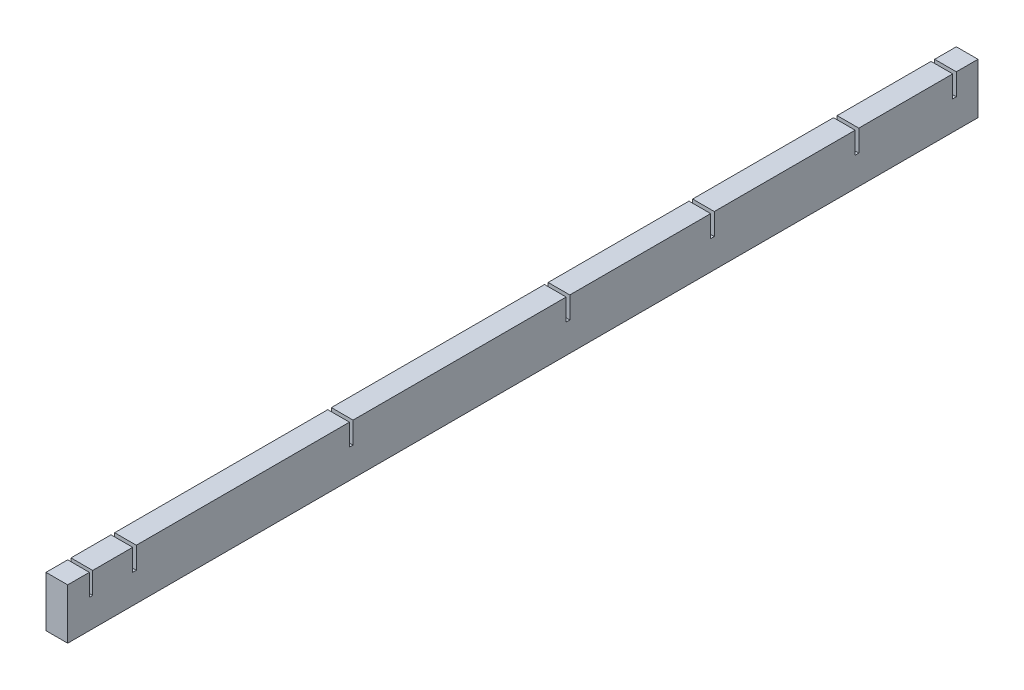
ISO-10303-21;
HEADER;
FILE_DESCRIPTION(('STEP AP214'),'2;1');
FILE_NAME('part.step','',(''),(''),'','','');
FILE_SCHEMA(('AUTOMOTIVE_DESIGN { 1 0 10303 214 1 1 1 1 }'));
ENDSEC;
DATA;
#1=APPLICATION_CONTEXT('core data for automotive mechanical design processes');
#2=APPLICATION_PROTOCOL_DEFINITION('international standard','automotive_design',2000,#1);
#3=PRODUCT_CONTEXT('',#1,'mechanical');
#4=PRODUCT('Part','Part','',(#3));
#5=PRODUCT_RELATED_PRODUCT_CATEGORY('part','',(#4));
#6=PRODUCT_DEFINITION_FORMATION('','',#4);
#7=PRODUCT_DEFINITION_CONTEXT('part definition',#1,'design');
#8=PRODUCT_DEFINITION('design','',#6,#7);
#9=PRODUCT_DEFINITION_SHAPE('','',#8);
#10=(LENGTH_UNIT() NAMED_UNIT(*) SI_UNIT(.MILLI.,.METRE.));
#11=(NAMED_UNIT(*) PLANE_ANGLE_UNIT() SI_UNIT($,.RADIAN.));
#12=(NAMED_UNIT(*) SI_UNIT($,.STERADIAN.) SOLID_ANGLE_UNIT());
#13=UNCERTAINTY_MEASURE_WITH_UNIT(LENGTH_MEASURE(1.E-05),#10,'distance_accuracy_value','');
#14=(GEOMETRIC_REPRESENTATION_CONTEXT(3) GLOBAL_UNCERTAINTY_ASSIGNED_CONTEXT((#13)) GLOBAL_UNIT_ASSIGNED_CONTEXT((#10,
#11,#12)) REPRESENTATION_CONTEXT('',''));
#15=CARTESIAN_POINT('',(0.,0.,0.));
#16=DIRECTION('',(0.,0.,1.));
#17=DIRECTION('',(1.,0.,0.));
#18=AXIS2_PLACEMENT_3D('',#15,#16,#17);
#19=CARTESIAN_POINT('',(-19.05,128.5875,-215.9));
#20=DIRECTION('',(0.,1.,0.));
#21=DIRECTION('',(0.,0.,1.));
#22=AXIS2_PLACEMENT_3D('',#19,#20,#21);
#23=PLANE('',#22);
#24=DIRECTION('',(1.,0.,0.));
#25=VECTOR('',#24,1.);
#26=CARTESIAN_POINT('',(-19.05,128.5875,508.));
#27=LINE('',#26,#25);
#28=CARTESIAN_POINT('',(-19.05,128.5875,508.));
#29=VERTEX_POINT('',#28);
#30=CARTESIAN_POINT('',(19.05,128.5875,508.));
#31=VERTEX_POINT('',#30);
#32=EDGE_CURVE('E275',#29,#31,#27,.T.);
#33=ORIENTED_EDGE('',*,*,#32,.F.);
#34=DIRECTION('',(0.,0.,1.));
#35=VECTOR('',#34,1.);
#36=CARTESIAN_POINT('',(-19.05,128.5875,-215.9));
#37=LINE('',#36,#35);
#38=CARTESIAN_POINT('',(-19.05,128.5875,882.65));
#39=VERTEX_POINT('',#38);
#40=EDGE_CURVE('E547',#29,#39,#37,.T.);
#41=ORIENTED_EDGE('',*,*,#40,.T.);
#42=DIRECTION('',(1.,0.,0.));
#43=VECTOR('',#42,1.);
#44=CARTESIAN_POINT('',(-19.05,128.5875,882.65));
#45=LINE('',#44,#43);
#46=CARTESIAN_POINT('',(19.05,128.5875,882.65));
#47=VERTEX_POINT('',#46);
#48=EDGE_CURVE('E328',#39,#47,#45,.T.);
#49=ORIENTED_EDGE('',*,*,#48,.T.);
#50=DIRECTION('',(0.,0.,1.));
#51=VECTOR('',#50,1.);
#52=CARTESIAN_POINT('',(19.05,128.5875,-215.9));
#53=LINE('',#52,#51);
#54=EDGE_CURVE('E530',#31,#47,#53,.T.);
#55=ORIENTED_EDGE('',*,*,#54,.F.);
#56=EDGE_LOOP('',(#33,#41,#49,#55));
#57=FACE_BOUND('',#56,.T.);
#58=ADVANCED_FACE('F34',(#57),#23,.T.);
#59=DIRECTION('',(1.,0.,0.));
#60=VECTOR('',#59,1.);
#61=CARTESIAN_POINT('',(-19.05,128.5875,1270.));
#62=LINE('',#61,#60);
#63=CARTESIAN_POINT('',(-19.05,128.5875,1270.));
#64=VERTEX_POINT('',#63);
#65=CARTESIAN_POINT('',(19.05,128.5875,1270.));
#66=VERTEX_POINT('',#65);
#67=EDGE_CURVE('E277',#64,#66,#62,.T.);
#68=ORIENTED_EDGE('',*,*,#67,.F.);
#69=CARTESIAN_POINT('',(-19.05,128.5875,1340.358));
#70=VERTEX_POINT('',#69);
#71=EDGE_CURVE('E268',#64,#70,#37,.T.);
#72=ORIENTED_EDGE('',*,*,#71,.T.);
#73=DIRECTION('',(1.,0.,0.));
#74=VECTOR('',#73,1.);
#75=CARTESIAN_POINT('',(-19.05,128.5875,1340.358));
#76=LINE('',#75,#74);
#77=CARTESIAN_POINT('',(19.05,128.5875,1340.358));
#78=VERTEX_POINT('',#77);
#79=EDGE_CURVE('E429',#70,#78,#76,.T.);
#80=ORIENTED_EDGE('',*,*,#79,.T.);
#81=EDGE_CURVE('E473',#66,#78,#53,.T.);
#82=ORIENTED_EDGE('',*,*,#81,.F.);
#83=EDGE_LOOP('',(#68,#72,#80,#82));
#84=FACE_BOUND('',#83,.T.);
#85=ADVANCED_FACE('F595',(#84),#23,.T.);
#86=DIRECTION('',(1.,0.,0.));
#87=VECTOR('',#86,1.);
#88=CARTESIAN_POINT('',(-19.05,128.5875,1263.65));
#89=LINE('',#88,#87);
#90=CARTESIAN_POINT('',(-19.05,128.5875,1263.65));
#91=VERTEX_POINT('',#90);
#92=CARTESIAN_POINT('',(19.05,128.5875,1263.65));
#93=VERTEX_POINT('',#92);
#94=EDGE_CURVE('E280',#91,#93,#89,.T.);
#95=ORIENTED_EDGE('',*,*,#94,.T.);
#96=CARTESIAN_POINT('',(19.05,128.5875,889.));
#97=VERTEX_POINT('',#96);
#98=EDGE_CURVE('E478',#97,#93,#53,.T.);
#99=ORIENTED_EDGE('',*,*,#98,.F.);
#100=DIRECTION('',(1.,0.,0.));
#101=VECTOR('',#100,1.);
#102=CARTESIAN_POINT('',(-19.05,128.5875,889.));
#103=LINE('',#102,#101);
#104=CARTESIAN_POINT('',(-19.05,128.5875,889.));
#105=VERTEX_POINT('',#104);
#106=EDGE_CURVE('E325',#105,#97,#103,.T.);
#107=ORIENTED_EDGE('',*,*,#106,.F.);
#108=EDGE_CURVE('E466',#105,#91,#37,.T.);
#109=ORIENTED_EDGE('',*,*,#108,.T.);
#110=EDGE_LOOP('',(#95,#99,#107,#109));
#111=FACE_BOUND('',#110,.T.);
#112=ADVANCED_FACE('F543',(#111),#23,.T.);
#113=DIRECTION('',(1.,0.,0.));
#114=VECTOR('',#113,1.);
#115=CARTESIAN_POINT('',(-19.05,128.5875,501.65));
#116=LINE('',#115,#114);
#117=CARTESIAN_POINT('',(-19.05,128.5875,501.65));
#118=VERTEX_POINT('',#117);
#119=CARTESIAN_POINT('',(19.05,128.5875,501.65));
#120=VERTEX_POINT('',#119);
#121=EDGE_CURVE('E302',#118,#120,#116,.T.);
#122=ORIENTED_EDGE('',*,*,#121,.T.);
#123=CARTESIAN_POINT('',(19.05,128.5875,254.));
#124=VERTEX_POINT('',#123);
#125=EDGE_CURVE('E528',#124,#120,#53,.T.);
#126=ORIENTED_EDGE('',*,*,#125,.F.);
#127=DIRECTION('',(1.,0.,0.));
#128=VECTOR('',#127,1.);
#129=CARTESIAN_POINT('',(-19.05,128.5875,254.));
#130=LINE('',#129,#128);
#131=CARTESIAN_POINT('',(-19.05,128.5875,254.));
#132=VERTEX_POINT('',#131);
#133=EDGE_CURVE('E297',#132,#124,#130,.T.);
#134=ORIENTED_EDGE('',*,*,#133,.F.);
#135=EDGE_CURVE('E549',#132,#118,#37,.T.);
#136=ORIENTED_EDGE('',*,*,#135,.T.);
#137=EDGE_LOOP('',(#122,#126,#134,#136));
#138=FACE_BOUND('',#137,.T.);
#139=ADVANCED_FACE('F566',(#138),#23,.T.);
#140=DIRECTION('',(1.,0.,0.));
#141=VECTOR('',#140,1.);
#142=CARTESIAN_POINT('',(-19.05,128.5875,247.65));
#143=LINE('',#142,#141);
#144=CARTESIAN_POINT('',(-19.05,128.5875,247.65));
#145=VERTEX_POINT('',#144);
#146=CARTESIAN_POINT('',(19.05,128.5875,247.65));
#147=VERTEX_POINT('',#146);
#148=EDGE_CURVE('E354',#145,#147,#143,.T.);
#149=ORIENTED_EDGE('',*,*,#148,.T.);
#150=CARTESIAN_POINT('',(19.05,128.5875,0.));
#151=VERTEX_POINT('',#150);
#152=EDGE_CURVE('E477',#151,#147,#53,.T.);
#153=ORIENTED_EDGE('',*,*,#152,.F.);
#154=DIRECTION('',(1.,0.,0.));
#155=VECTOR('',#154,1.);
#156=CARTESIAN_POINT('',(-19.05,128.5875,0.));
#157=LINE('',#156,#155);
#158=CARTESIAN_POINT('',(-19.05,128.5875,0.));
#159=VERTEX_POINT('',#158);
#160=EDGE_CURVE('E349',#159,#151,#157,.T.);
#161=ORIENTED_EDGE('',*,*,#160,.F.);
#162=EDGE_CURVE('E465',#159,#145,#37,.T.);
#163=ORIENTED_EDGE('',*,*,#162,.T.);
#164=EDGE_LOOP('',(#149,#153,#161,#163));
#165=FACE_BOUND('',#164,.T.);
#166=ADVANCED_FACE('F526',(#165),#23,.T.);
#167=DIRECTION('',(1.,0.,0.));
#168=VECTOR('',#167,1.);
#169=CARTESIAN_POINT('',(-19.05,128.5875,-177.8));
#170=LINE('',#169,#168);
#171=CARTESIAN_POINT('',(-19.05,128.5875,-177.8));
#172=VERTEX_POINT('',#171);
#173=CARTESIAN_POINT('',(19.05,128.5875,-177.8));
#174=VERTEX_POINT('',#173);
#175=EDGE_CURVE('E394',#172,#174,#170,.T.);
#176=ORIENTED_EDGE('',*,*,#175,.T.);
#177=CARTESIAN_POINT('',(19.05,128.5875,-215.9));
#178=VERTEX_POINT('',#177);
#179=EDGE_CURVE('E38',#178,#174,#53,.T.);
#180=ORIENTED_EDGE('',*,*,#179,.F.);
#181=DIRECTION('',(-1.,0.,0.));
#182=VECTOR('',#181,1.);
#183=CARTESIAN_POINT('',(-19.05,128.5875,-215.9));
#184=LINE('',#183,#182);
#185=CARTESIAN_POINT('',(-19.05,128.5875,-215.9));
#186=VERTEX_POINT('',#185);
#187=EDGE_CURVE('E449',#178,#186,#184,.T.);
#188=ORIENTED_EDGE('',*,*,#187,.T.);
#189=EDGE_CURVE('E459',#186,#172,#37,.T.);
#190=ORIENTED_EDGE('',*,*,#189,.T.);
#191=EDGE_LOOP('',(#176,#180,#188,#190));
#192=FACE_BOUND('',#191,.T.);
#193=ADVANCED_FACE('F497',(#192),#23,.T.);
#194=DIRECTION('',(1.,0.,0.));
#195=VECTOR('',#194,1.);
#196=CARTESIAN_POINT('',(-19.05,128.5875,1346.2));
#197=LINE('',#196,#195);
#198=CARTESIAN_POINT('',(-19.05,128.5875,1346.2));
#199=VERTEX_POINT('',#198);
#200=CARTESIAN_POINT('',(19.05,128.5875,1346.2));
#201=VERTEX_POINT('',#200);
#202=EDGE_CURVE('E426',#199,#201,#197,.T.);
#203=ORIENTED_EDGE('',*,*,#202,.F.);
#204=CARTESIAN_POINT('',(-19.05,128.5875,1384.3));
#205=VERTEX_POINT('',#204);
#206=EDGE_CURVE('E462',#199,#205,#37,.T.);
#207=ORIENTED_EDGE('',*,*,#206,.T.);
#208=DIRECTION('',(-1.,0.,0.));
#209=VECTOR('',#208,1.);
#210=CARTESIAN_POINT('',(-19.05,128.5875,1384.3));
#211=LINE('',#210,#209);
#212=CARTESIAN_POINT('',(19.05,128.5875,1384.3));
#213=VERTEX_POINT('',#212);
#214=EDGE_CURVE('E437',#213,#205,#211,.T.);
#215=ORIENTED_EDGE('',*,*,#214,.F.);
#216=EDGE_CURVE('E457',#201,#213,#53,.T.);
#217=ORIENTED_EDGE('',*,*,#216,.F.);
#218=EDGE_LOOP('',(#203,#207,#215,#217));
#219=FACE_BOUND('',#218,.T.);
#220=ADVANCED_FACE('F484',(#219),#23,.T.);
#221=CARTESIAN_POINT('',(19.05,39.6875,-215.9));
#222=DIRECTION('',(1.,0.,0.));
#223=DIRECTION('',(0.,0.,-1.));
#224=AXIS2_PLACEMENT_3D('',#221,#222,#223);
#225=PLANE('',#224);
#226=DIRECTION('',(0.,-1.,0.));
#227=VECTOR('',#226,1.);
#228=CARTESIAN_POINT('',(19.05,128.5875,508.));
#229=LINE('',#228,#227);
#230=CARTESIAN_POINT('',(19.05,90.4875,508.));
#231=VERTEX_POINT('',#230);
#232=EDGE_CURVE('E293',#31,#231,#229,.T.);
#233=ORIENTED_EDGE('',*,*,#232,.F.);
#234=ORIENTED_EDGE('',*,*,#54,.T.);
#235=DIRECTION('',(0.,1.,0.));
#236=VECTOR('',#235,1.);
#237=CARTESIAN_POINT('',(19.05,128.5875,882.65));
#238=LINE('',#237,#236);
#239=CARTESIAN_POINT('',(19.05,90.4875,882.65));
#240=VERTEX_POINT('',#239);
#241=EDGE_CURVE('E312',#240,#47,#238,.T.);
#242=ORIENTED_EDGE('',*,*,#241,.F.);
#243=DIRECTION('',(0.,0.,-1.));
#244=VECTOR('',#243,1.);
#245=CARTESIAN_POINT('',(19.05,90.4875,889.));
#246=LINE('',#245,#244);
#247=CARTESIAN_POINT('',(19.05,90.4875,889.));
#248=VERTEX_POINT('',#247);
#249=EDGE_CURVE('E321',#248,#240,#246,.T.);
#250=ORIENTED_EDGE('',*,*,#249,.F.);
#251=DIRECTION('',(0.,-1.,0.));
#252=VECTOR('',#251,1.);
#253=CARTESIAN_POINT('',(19.05,128.5875,889.));
#254=LINE('',#253,#252);
#255=EDGE_CURVE('E279',#97,#248,#254,.T.);
#256=ORIENTED_EDGE('',*,*,#255,.F.);
#257=ORIENTED_EDGE('',*,*,#98,.T.);
#258=DIRECTION('',(0.,1.,0.));
#259=VECTOR('',#258,1.);
#260=CARTESIAN_POINT('',(19.05,128.5875,1263.65));
#261=LINE('',#260,#259);
#262=CARTESIAN_POINT('',(19.05,90.4875,1263.65));
#263=VERTEX_POINT('',#262);
#264=EDGE_CURVE('E59',#263,#93,#261,.T.);
#265=ORIENTED_EDGE('',*,*,#264,.F.);
#266=DIRECTION('',(0.,0.,-1.));
#267=VECTOR('',#266,1.);
#268=CARTESIAN_POINT('',(19.05,90.4875,1270.));
#269=LINE('',#268,#267);
#270=CARTESIAN_POINT('',(19.05,90.4875,1270.));
#271=VERTEX_POINT('',#270);
#272=EDGE_CURVE('E270',#271,#263,#269,.T.);
#273=ORIENTED_EDGE('',*,*,#272,.F.);
#274=DIRECTION('',(0.,-1.,0.));
#275=VECTOR('',#274,1.);
#276=CARTESIAN_POINT('',(19.05,128.5875,1270.));
#277=LINE('',#276,#275);
#278=EDGE_CURVE('E250',#66,#271,#277,.T.);
#279=ORIENTED_EDGE('',*,*,#278,.F.);
#280=ORIENTED_EDGE('',*,*,#81,.T.);
#281=DIRECTION('',(0.,1.,0.));
#282=VECTOR('',#281,1.);
#283=CARTESIAN_POINT('',(19.05,128.5875,1340.358));
#284=LINE('',#283,#282);
#285=CARTESIAN_POINT('',(19.05,90.4875,1340.358));
#286=VERTEX_POINT('',#285);
#287=EDGE_CURVE('E413',#286,#78,#284,.T.);
#288=ORIENTED_EDGE('',*,*,#287,.F.);
#289=DIRECTION('',(0.,0.,-1.));
#290=VECTOR('',#289,1.);
#291=CARTESIAN_POINT('',(19.05,90.4875,1346.2));
#292=LINE('',#291,#290);
#293=CARTESIAN_POINT('',(19.05,90.4875,1346.2));
#294=VERTEX_POINT('',#293);
#295=EDGE_CURVE('E421',#294,#286,#292,.T.);
#296=ORIENTED_EDGE('',*,*,#295,.F.);
#297=DIRECTION('',(0.,-1.,0.));
#298=VECTOR('',#297,1.);
#299=CARTESIAN_POINT('',(19.05,128.5875,1346.2));
#300=LINE('',#299,#298);
#301=EDGE_CURVE('E327',#201,#294,#300,.T.);
#302=ORIENTED_EDGE('',*,*,#301,.F.);
#303=ORIENTED_EDGE('',*,*,#216,.T.);
#304=DIRECTION('',(0.,1.,0.));
#305=VECTOR('',#304,1.);
#306=CARTESIAN_POINT('',(19.05,39.6875,1384.3));
#307=LINE('',#306,#305);
#308=CARTESIAN_POINT('',(19.05,39.6875,1384.3));
#309=VERTEX_POINT('',#308);
#310=EDGE_CURVE('E428',#309,#213,#307,.T.);
#311=ORIENTED_EDGE('',*,*,#310,.F.);
#312=DIRECTION('',(0.,0.,1.));
#313=VECTOR('',#312,1.);
#314=CARTESIAN_POINT('',(19.05,39.6875,-215.9));
#315=LINE('',#314,#313);
#316=CARTESIAN_POINT('',(19.05,39.6875,-215.9));
#317=VERTEX_POINT('',#316);
#318=EDGE_CURVE('E11',#317,#309,#315,.T.);
#319=ORIENTED_EDGE('',*,*,#318,.F.);
#320=DIRECTION('',(0.,1.,0.));
#321=VECTOR('',#320,1.);
#322=CARTESIAN_POINT('',(19.05,39.6875,-215.9));
#323=LINE('',#322,#321);
#324=EDGE_CURVE('E446',#317,#178,#323,.T.);
#325=ORIENTED_EDGE('',*,*,#324,.T.);
#326=ORIENTED_EDGE('',*,*,#179,.T.);
#327=DIRECTION('',(0.,1.,0.));
#328=VECTOR('',#327,1.);
#329=CARTESIAN_POINT('',(19.05,128.5875,-177.8));
#330=LINE('',#329,#328);
#331=CARTESIAN_POINT('',(19.05,90.4875,-177.8));
#332=VERTEX_POINT('',#331);
#333=EDGE_CURVE('E395',#332,#174,#330,.T.);
#334=ORIENTED_EDGE('',*,*,#333,.F.);
#335=DIRECTION('',(0.,0.,-1.));
#336=VECTOR('',#335,1.);
#337=CARTESIAN_POINT('',(19.05,90.4875,-177.8));
#338=LINE('',#337,#336);
#339=CARTESIAN_POINT('',(19.05,90.4875,-171.45));
#340=VERTEX_POINT('',#339);
#341=EDGE_CURVE('E389',#340,#332,#338,.T.);
#342=ORIENTED_EDGE('',*,*,#341,.F.);
#343=DIRECTION('',(0.,-1.,0.));
#344=VECTOR('',#343,1.);
#345=CARTESIAN_POINT('',(19.05,128.5875,-171.45));
#346=LINE('',#345,#344);
#347=CARTESIAN_POINT('',(19.05,128.5875,-171.45));
#348=VERTEX_POINT('',#347);
#349=EDGE_CURVE('E397',#348,#340,#346,.T.);
#350=ORIENTED_EDGE('',*,*,#349,.F.);
#351=CARTESIAN_POINT('',(19.05,128.5875,-6.35000000000002));
#352=VERTEX_POINT('',#351);
#353=EDGE_CURVE('E472',#348,#352,#53,.T.);
#354=ORIENTED_EDGE('',*,*,#353,.T.);
#355=DIRECTION('',(0.,1.,0.));
#356=VECTOR('',#355,1.);
#357=CARTESIAN_POINT('',(19.05,128.5875,-6.35000000000003));
#358=LINE('',#357,#356);
#359=CARTESIAN_POINT('',(19.05,90.4875,-6.35000000000003));
#360=VERTEX_POINT('',#359);
#361=EDGE_CURVE('E364',#360,#352,#358,.T.);
#362=ORIENTED_EDGE('',*,*,#361,.F.);
#363=DIRECTION('',(0.,0.,-1.));
#364=VECTOR('',#363,1.);
#365=CARTESIAN_POINT('',(19.05,90.4875,0.));
#366=LINE('',#365,#364);
#367=CARTESIAN_POINT('',(19.05,90.4875,0.));
#368=VERTEX_POINT('',#367);
#369=EDGE_CURVE('E374',#368,#360,#366,.T.);
#370=ORIENTED_EDGE('',*,*,#369,.F.);
#371=DIRECTION('',(0.,-1.,0.));
#372=VECTOR('',#371,1.);
#373=CARTESIAN_POINT('',(19.05,128.5875,0.));
#374=LINE('',#373,#372);
#375=EDGE_CURVE('E371',#151,#368,#374,.T.);
#376=ORIENTED_EDGE('',*,*,#375,.F.);
#377=ORIENTED_EDGE('',*,*,#152,.T.);
#378=DIRECTION('',(0.,1.,0.));
#379=VECTOR('',#378,1.);
#380=CARTESIAN_POINT('',(19.05,128.5875,247.65));
#381=LINE('',#380,#379);
#382=CARTESIAN_POINT('',(19.05,90.4875,247.65));
#383=VERTEX_POINT('',#382);
#384=EDGE_CURVE('E338',#383,#147,#381,.T.);
#385=ORIENTED_EDGE('',*,*,#384,.F.);
#386=DIRECTION('',(0.,0.,-1.));
#387=VECTOR('',#386,1.);
#388=CARTESIAN_POINT('',(19.05,90.4875,254.));
#389=LINE('',#388,#387);
#390=CARTESIAN_POINT('',(19.05,90.4875,254.));
#391=VERTEX_POINT('',#390);
#392=EDGE_CURVE('E348',#391,#383,#389,.T.);
#393=ORIENTED_EDGE('',*,*,#392,.F.);
#394=DIRECTION('',(0.,-1.,0.));
#395=VECTOR('',#394,1.);
#396=CARTESIAN_POINT('',(19.05,128.5875,254.));
#397=LINE('',#396,#395);
#398=EDGE_CURVE('E345',#124,#391,#397,.T.);
#399=ORIENTED_EDGE('',*,*,#398,.F.);
#400=ORIENTED_EDGE('',*,*,#125,.T.);
#401=DIRECTION('',(0.,1.,0.));
#402=VECTOR('',#401,1.);
#403=CARTESIAN_POINT('',(19.05,128.5875,501.65));
#404=LINE('',#403,#402);
#405=CARTESIAN_POINT('',(19.05,90.4875,501.65));
#406=VERTEX_POINT('',#405);
#407=EDGE_CURVE('E286',#406,#120,#404,.T.);
#408=ORIENTED_EDGE('',*,*,#407,.F.);
#409=DIRECTION('',(0.,0.,-1.));
#410=VECTOR('',#409,1.);
#411=CARTESIAN_POINT('',(19.05,90.4875,508.));
#412=LINE('',#411,#410);
#413=EDGE_CURVE('E296',#231,#406,#412,.T.);
#414=ORIENTED_EDGE('',*,*,#413,.F.);
#415=EDGE_LOOP('',(#233,#234,#242,#250,#256,#257,#265,#273,#279,#280,#288,#296,#302,#303,#311,
#319,#325,#326,#334,#342,#350,#354,#362,#370,#376,#377,#385,#393,#399,#400,#408,#414));
#416=FACE_BOUND('',#415,.T.);
#417=ADVANCED_FACE('F36',(#416),#225,.T.);
#418=CARTESIAN_POINT('',(-19.05,39.6875,-215.9));
#419=DIRECTION('',(0.,-1.,0.));
#420=DIRECTION('',(0.,0.,-1.));
#421=AXIS2_PLACEMENT_3D('',#418,#419,#420);
#422=PLANE('',#421);
#423=ORIENTED_EDGE('',*,*,#318,.T.);
#424=DIRECTION('',(1.,0.,0.));
#425=VECTOR('',#424,1.);
#426=CARTESIAN_POINT('',(-19.05,39.6875,1384.3));
#427=LINE('',#426,#425);
#428=CARTESIAN_POINT('',(-19.05,39.6875,1384.3));
#429=VERTEX_POINT('',#428);
#430=EDGE_CURVE('E443',#429,#309,#427,.T.);
#431=ORIENTED_EDGE('',*,*,#430,.F.);
#432=DIRECTION('',(0.,0.,1.));
#433=VECTOR('',#432,1.);
#434=CARTESIAN_POINT('',(-19.05,39.6875,-215.9));
#435=LINE('',#434,#433);
#436=CARTESIAN_POINT('',(-19.05,39.6875,-215.9));
#437=VERTEX_POINT('',#436);
#438=EDGE_CURVE('E43',#437,#429,#435,.T.);
#439=ORIENTED_EDGE('',*,*,#438,.F.);
#440=DIRECTION('',(1.,0.,0.));
#441=VECTOR('',#440,1.);
#442=CARTESIAN_POINT('',(-19.05,39.6875,-215.9));
#443=LINE('',#442,#441);
#444=EDGE_CURVE('E455',#437,#317,#443,.T.);
#445=ORIENTED_EDGE('',*,*,#444,.T.);
#446=EDGE_LOOP('',(#423,#431,#439,#445));
#447=FACE_BOUND('',#446,.T.);
#448=ADVANCED_FACE('F490',(#447),#422,.T.);
#449=CARTESIAN_POINT('',(-19.05,39.6875,-215.9));
#450=DIRECTION('',(-1.,0.,0.));
#451=DIRECTION('',(0.,0.,1.));
#452=AXIS2_PLACEMENT_3D('',#449,#450,#451);
#453=PLANE('',#452);
#454=DIRECTION('',(0.,-1.,0.));
#455=VECTOR('',#454,1.);
#456=CARTESIAN_POINT('',(-19.05,128.5875,508.));
#457=LINE('',#456,#455);
#458=CARTESIAN_POINT('',(-19.05,90.4875,508.));
#459=VERTEX_POINT('',#458);
#460=EDGE_CURVE('E283',#29,#459,#457,.T.);
#461=ORIENTED_EDGE('',*,*,#460,.T.);
#462=DIRECTION('',(0.,0.,-1.));
#463=VECTOR('',#462,1.);
#464=CARTESIAN_POINT('',(-19.05,90.4875,508.));
#465=LINE('',#464,#463);
#466=CARTESIAN_POINT('',(-19.05,90.4875,501.65));
#467=VERTEX_POINT('',#466);
#468=EDGE_CURVE('E285',#459,#467,#465,.T.);
#469=ORIENTED_EDGE('',*,*,#468,.T.);
#470=DIRECTION('',(0.,1.,0.));
#471=VECTOR('',#470,1.);
#472=CARTESIAN_POINT('',(-19.05,128.5875,501.65));
#473=LINE('',#472,#471);
#474=EDGE_CURVE('E289',#467,#118,#473,.T.);
#475=ORIENTED_EDGE('',*,*,#474,.T.);
#476=ORIENTED_EDGE('',*,*,#135,.F.);
#477=DIRECTION('',(0.,-1.,0.));
#478=VECTOR('',#477,1.);
#479=CARTESIAN_POINT('',(-19.05,128.5875,254.));
#480=LINE('',#479,#478);
#481=CARTESIAN_POINT('',(-19.05,90.4875,254.));
#482=VERTEX_POINT('',#481);
#483=EDGE_CURVE('E334',#132,#482,#480,.T.);
#484=ORIENTED_EDGE('',*,*,#483,.T.);
#485=DIRECTION('',(0.,0.,-1.));
#486=VECTOR('',#485,1.);
#487=CARTESIAN_POINT('',(-19.05,90.4875,254.));
#488=LINE('',#487,#486);
#489=CARTESIAN_POINT('',(-19.05,90.4875,247.65));
#490=VERTEX_POINT('',#489);
#491=EDGE_CURVE('E337',#482,#490,#488,.T.);
#492=ORIENTED_EDGE('',*,*,#491,.T.);
#493=DIRECTION('',(0.,1.,0.));
#494=VECTOR('',#493,1.);
#495=CARTESIAN_POINT('',(-19.05,128.5875,247.65));
#496=LINE('',#495,#494);
#497=EDGE_CURVE('E341',#490,#145,#496,.T.);
#498=ORIENTED_EDGE('',*,*,#497,.T.);
#499=ORIENTED_EDGE('',*,*,#162,.F.);
#500=DIRECTION('',(0.,-1.,0.));
#501=VECTOR('',#500,1.);
#502=CARTESIAN_POINT('',(-19.05,128.5875,0.));
#503=LINE('',#502,#501);
#504=CARTESIAN_POINT('',(-19.05,90.4875,0.));
#505=VERTEX_POINT('',#504);
#506=EDGE_CURVE('E360',#159,#505,#503,.T.);
#507=ORIENTED_EDGE('',*,*,#506,.T.);
#508=DIRECTION('',(0.,0.,-1.));
#509=VECTOR('',#508,1.);
#510=CARTESIAN_POINT('',(-19.05,90.4875,0.));
#511=LINE('',#510,#509);
#512=CARTESIAN_POINT('',(-19.05,90.4875,-6.35000000000003));
#513=VERTEX_POINT('',#512);
#514=EDGE_CURVE('E363',#505,#513,#511,.T.);
#515=ORIENTED_EDGE('',*,*,#514,.T.);
#516=DIRECTION('',(0.,1.,0.));
#517=VECTOR('',#516,1.);
#518=CARTESIAN_POINT('',(-19.05,128.5875,-6.35000000000003));
#519=LINE('',#518,#517);
#520=CARTESIAN_POINT('',(-19.05,128.5875,-6.35000000000003));
#521=VERTEX_POINT('',#520);
#522=EDGE_CURVE('E367',#513,#521,#519,.T.);
#523=ORIENTED_EDGE('',*,*,#522,.T.);
#524=CARTESIAN_POINT('',(-19.05,128.5875,-171.45));
#525=VERTEX_POINT('',#524);
#526=EDGE_CURVE('E461',#525,#521,#37,.T.);
#527=ORIENTED_EDGE('',*,*,#526,.F.);
#528=DIRECTION('',(0.,-1.,0.));
#529=VECTOR('',#528,1.);
#530=CARTESIAN_POINT('',(-19.05,128.5875,-171.45));
#531=LINE('',#530,#529);
#532=CARTESIAN_POINT('',(-19.05,90.4875,-171.45));
#533=VERTEX_POINT('',#532);
#534=EDGE_CURVE('E51',#525,#533,#531,.T.);
#535=ORIENTED_EDGE('',*,*,#534,.T.);
#536=DIRECTION('',(0.,0.,-1.));
#537=VECTOR('',#536,1.);
#538=CARTESIAN_POINT('',(-19.05,90.4875,-177.8));
#539=LINE('',#538,#537);
#540=CARTESIAN_POINT('',(-19.05,90.4875,-177.8));
#541=VERTEX_POINT('',#540);
#542=EDGE_CURVE('E391',#533,#541,#539,.T.);
#543=ORIENTED_EDGE('',*,*,#542,.T.);
#544=DIRECTION('',(0.,1.,0.));
#545=VECTOR('',#544,1.);
#546=CARTESIAN_POINT('',(-19.05,128.5875,-177.8));
#547=LINE('',#546,#545);
#548=EDGE_CURVE('E386',#541,#172,#547,.T.);
#549=ORIENTED_EDGE('',*,*,#548,.T.);
#550=ORIENTED_EDGE('',*,*,#189,.F.);
#551=DIRECTION('',(0.,-1.,0.));
#552=VECTOR('',#551,1.);
#553=CARTESIAN_POINT('',(-19.05,39.6875,-215.9));
#554=LINE('',#553,#552);
#555=EDGE_CURVE('E452',#186,#437,#554,.T.);
#556=ORIENTED_EDGE('',*,*,#555,.T.);
#557=ORIENTED_EDGE('',*,*,#438,.T.);
#558=DIRECTION('',(0.,-1.,0.));
#559=VECTOR('',#558,1.);
#560=CARTESIAN_POINT('',(-19.05,39.6875,1384.3));
#561=LINE('',#560,#559);
#562=EDGE_CURVE('E440',#205,#429,#561,.T.);
#563=ORIENTED_EDGE('',*,*,#562,.F.);
#564=ORIENTED_EDGE('',*,*,#206,.F.);
#565=DIRECTION('',(0.,-1.,0.));
#566=VECTOR('',#565,1.);
#567=CARTESIAN_POINT('',(-19.05,128.5875,1346.2));
#568=LINE('',#567,#566);
#569=CARTESIAN_POINT('',(-19.05,90.4875,1346.2));
#570=VERTEX_POINT('',#569);
#571=EDGE_CURVE('E409',#199,#570,#568,.T.);
#572=ORIENTED_EDGE('',*,*,#571,.T.);
#573=DIRECTION('',(0.,0.,-1.));
#574=VECTOR('',#573,1.);
#575=CARTESIAN_POINT('',(-19.05,90.4875,1346.2));
#576=LINE('',#575,#574);
#577=CARTESIAN_POINT('',(-19.05,90.4875,1340.358));
#578=VERTEX_POINT('',#577);
#579=EDGE_CURVE('E412',#570,#578,#576,.T.);
#580=ORIENTED_EDGE('',*,*,#579,.T.);
#581=DIRECTION('',(0.,1.,0.));
#582=VECTOR('',#581,1.);
#583=CARTESIAN_POINT('',(-19.05,128.5875,1340.358));
#584=LINE('',#583,#582);
#585=EDGE_CURVE('E416',#578,#70,#584,.T.);
#586=ORIENTED_EDGE('',*,*,#585,.T.);
#587=ORIENTED_EDGE('',*,*,#71,.F.);
#588=DIRECTION('',(0.,-1.,0.));
#589=VECTOR('',#588,1.);
#590=CARTESIAN_POINT('',(-19.05,128.5875,1270.));
#591=LINE('',#590,#589);
#592=CARTESIAN_POINT('',(-19.05,90.4875,1270.));
#593=VERTEX_POINT('',#592);
#594=EDGE_CURVE('E247',#64,#593,#591,.T.);
#595=ORIENTED_EDGE('',*,*,#594,.T.);
#596=DIRECTION('',(0.,0.,-1.));
#597=VECTOR('',#596,1.);
#598=CARTESIAN_POINT('',(-19.05,90.4875,1270.));
#599=LINE('',#598,#597);
#600=CARTESIAN_POINT('',(-19.05,90.4875,1263.65));
#601=VERTEX_POINT('',#600);
#602=EDGE_CURVE('E258',#593,#601,#599,.T.);
#603=ORIENTED_EDGE('',*,*,#602,.T.);
#604=DIRECTION('',(0.,1.,0.));
#605=VECTOR('',#604,1.);
#606=CARTESIAN_POINT('',(-19.05,128.5875,1263.65));
#607=LINE('',#606,#605);
#608=EDGE_CURVE('E255',#601,#91,#607,.T.);
#609=ORIENTED_EDGE('',*,*,#608,.T.);
#610=ORIENTED_EDGE('',*,*,#108,.F.);
#611=DIRECTION('',(0.,-1.,0.));
#612=VECTOR('',#611,1.);
#613=CARTESIAN_POINT('',(-19.05,128.5875,889.));
#614=LINE('',#613,#612);
#615=CARTESIAN_POINT('',(-19.05,90.4875,889.));
#616=VERTEX_POINT('',#615);
#617=EDGE_CURVE('E308',#105,#616,#614,.T.);
#618=ORIENTED_EDGE('',*,*,#617,.T.);
#619=DIRECTION('',(0.,0.,-1.));
#620=VECTOR('',#619,1.);
#621=CARTESIAN_POINT('',(-19.05,90.4875,889.));
#622=LINE('',#621,#620);
#623=CARTESIAN_POINT('',(-19.05,90.4875,882.65));
#624=VERTEX_POINT('',#623);
#625=EDGE_CURVE('E311',#616,#624,#622,.T.);
#626=ORIENTED_EDGE('',*,*,#625,.T.);
#627=DIRECTION('',(0.,1.,0.));
#628=VECTOR('',#627,1.);
#629=CARTESIAN_POINT('',(-19.05,128.5875,882.65));
#630=LINE('',#629,#628);
#631=EDGE_CURVE('E315',#624,#39,#630,.T.);
#632=ORIENTED_EDGE('',*,*,#631,.T.);
#633=ORIENTED_EDGE('',*,*,#40,.F.);
#634=EDGE_LOOP('',(#461,#469,#475,#476,#484,#492,#498,#499,#507,#515,#523,#527,#535,#543,#549,
#550,#556,#557,#563,#564,#572,#580,#586,#587,#595,#603,#609,#610,#618,#626,#632,#633));
#635=FACE_BOUND('',#634,.T.);
#636=ADVANCED_FACE('F266',(#635),#453,.T.);
#637=DIRECTION('',(1.,0.,0.));
#638=VECTOR('',#637,1.);
#639=CARTESIAN_POINT('',(-19.05,128.5875,-6.35000000000003));
#640=LINE('',#639,#638);
#641=EDGE_CURVE('E380',#521,#352,#640,.T.);
#642=ORIENTED_EDGE('',*,*,#641,.T.);
#643=ORIENTED_EDGE('',*,*,#353,.F.);
#644=DIRECTION('',(1.,0.,0.));
#645=VECTOR('',#644,1.);
#646=CARTESIAN_POINT('',(-19.05,128.5875,-171.45));
#647=LINE('',#646,#645);
#648=EDGE_CURVE('E405',#525,#348,#647,.T.);
#649=ORIENTED_EDGE('',*,*,#648,.F.);
#650=ORIENTED_EDGE('',*,*,#526,.T.);
#651=EDGE_LOOP('',(#642,#643,#649,#650));
#652=FACE_BOUND('',#651,.T.);
#653=ADVANCED_FACE('F510',(#652),#23,.T.);
#654=CARTESIAN_POINT('',(0.,0.,-215.9));
#655=DIRECTION('',(0.,0.,-1.));
#656=DIRECTION('',(-1.,0.,0.));
#657=AXIS2_PLACEMENT_3D('',#654,#655,#656);
#658=PLANE('',#657);
#659=ORIENTED_EDGE('',*,*,#324,.F.);
#660=ORIENTED_EDGE('',*,*,#444,.F.);
#661=ORIENTED_EDGE('',*,*,#555,.F.);
#662=ORIENTED_EDGE('',*,*,#187,.F.);
#663=EDGE_LOOP('',(#659,#660,#661,#662));
#664=FACE_BOUND('',#663,.T.);
#665=ADVANCED_FACE('F495',(#664),#658,.T.);
#666=CARTESIAN_POINT('',(0.,0.,1384.3));
#667=DIRECTION('',(0.,0.,-1.));
#668=DIRECTION('',(-1.,0.,0.));
#669=AXIS2_PLACEMENT_3D('',#666,#667,#668);
#670=PLANE('',#669);
#671=ORIENTED_EDGE('',*,*,#310,.T.);
#672=ORIENTED_EDGE('',*,*,#214,.T.);
#673=ORIENTED_EDGE('',*,*,#562,.T.);
#674=ORIENTED_EDGE('',*,*,#430,.T.);
#675=EDGE_LOOP('',(#671,#672,#673,#674));
#676=FACE_BOUND('',#675,.T.);
#677=ADVANCED_FACE('F487',(#676),#670,.F.);
#678=CARTESIAN_POINT('',(-19.05,128.5875,1346.2));
#679=DIRECTION('',(0.,0.,1.));
#680=DIRECTION('',(1.,0.,0.));
#681=AXIS2_PLACEMENT_3D('',#678,#679,#680);
#682=PLANE('',#681);
#683=ORIENTED_EDGE('',*,*,#301,.T.);
#684=DIRECTION('',(1.,0.,0.));
#685=VECTOR('',#684,1.);
#686=CARTESIAN_POINT('',(-19.05,90.4875,1346.2));
#687=LINE('',#686,#685);
#688=EDGE_CURVE('E418',#570,#294,#687,.T.);
#689=ORIENTED_EDGE('',*,*,#688,.F.);
#690=ORIENTED_EDGE('',*,*,#571,.F.);
#691=ORIENTED_EDGE('',*,*,#202,.T.);
#692=EDGE_LOOP('',(#683,#689,#690,#691));
#693=FACE_BOUND('',#692,.T.);
#694=ADVANCED_FACE('F642',(#693),#682,.F.);
#695=CARTESIAN_POINT('',(-19.05,128.5875,1340.358));
#696=DIRECTION('',(0.,0.,-1.));
#697=DIRECTION('',(0.,1.,0.));
#698=AXIS2_PLACEMENT_3D('',#695,#696,#697);
#699=PLANE('',#698);
#700=ORIENTED_EDGE('',*,*,#287,.T.);
#701=ORIENTED_EDGE('',*,*,#79,.F.);
#702=ORIENTED_EDGE('',*,*,#585,.F.);
#703=DIRECTION('',(1.,0.,0.));
#704=VECTOR('',#703,1.);
#705=CARTESIAN_POINT('',(-19.05,90.4875,1340.358));
#706=LINE('',#705,#704);
#707=EDGE_CURVE('E432',#578,#286,#706,.T.);
#708=ORIENTED_EDGE('',*,*,#707,.T.);
#709=EDGE_LOOP('',(#700,#701,#702,#708));
#710=FACE_BOUND('',#709,.T.);
#711=ADVANCED_FACE('F645',(#710),#699,.F.);
#712=CARTESIAN_POINT('',(-19.05,90.4875,1346.2));
#713=DIRECTION('',(0.,-1.,0.));
#714=DIRECTION('',(0.,0.,-1.));
#715=AXIS2_PLACEMENT_3D('',#712,#713,#714);
#716=PLANE('',#715);
#717=ORIENTED_EDGE('',*,*,#295,.T.);
#718=ORIENTED_EDGE('',*,*,#707,.F.);
#719=ORIENTED_EDGE('',*,*,#579,.F.);
#720=ORIENTED_EDGE('',*,*,#688,.T.);
#721=EDGE_LOOP('',(#717,#718,#719,#720));
#722=FACE_BOUND('',#721,.T.);
#723=ADVANCED_FACE('F652',(#722),#716,.F.);
#724=CARTESIAN_POINT('',(-19.05,128.5875,-177.8));
#725=DIRECTION('',(0.,0.,-1.));
#726=DIRECTION('',(-1.,0.,0.));
#727=AXIS2_PLACEMENT_3D('',#724,#725,#726);
#728=PLANE('',#727);
#729=ORIENTED_EDGE('',*,*,#333,.T.);
#730=ORIENTED_EDGE('',*,*,#175,.F.);
#731=ORIENTED_EDGE('',*,*,#548,.F.);
#732=DIRECTION('',(1.,0.,0.));
#733=VECTOR('',#732,1.);
#734=CARTESIAN_POINT('',(-19.05,90.4875,-177.8));
#735=LINE('',#734,#733);
#736=EDGE_CURVE('E375',#541,#332,#735,.T.);
#737=ORIENTED_EDGE('',*,*,#736,.T.);
#738=EDGE_LOOP('',(#729,#730,#731,#737));
#739=FACE_BOUND('',#738,.T.);
#740=ADVANCED_FACE('F500',(#739),#728,.F.);
#741=CARTESIAN_POINT('',(-19.05,90.4875,-177.8));
#742=DIRECTION('',(0.,-1.,0.));
#743=DIRECTION('',(0.,0.,-1.));
#744=AXIS2_PLACEMENT_3D('',#741,#742,#743);
#745=PLANE('',#744);
#746=ORIENTED_EDGE('',*,*,#341,.T.);
#747=ORIENTED_EDGE('',*,*,#736,.F.);
#748=ORIENTED_EDGE('',*,*,#542,.F.);
#749=DIRECTION('',(1.,0.,0.));
#750=VECTOR('',#749,1.);
#751=CARTESIAN_POINT('',(-19.05,90.4875,-171.45));
#752=LINE('',#751,#750);
#753=EDGE_CURVE('E403',#533,#340,#752,.T.);
#754=ORIENTED_EDGE('',*,*,#753,.T.);
#755=EDGE_LOOP('',(#746,#747,#748,#754));
#756=FACE_BOUND('',#755,.T.);
#757=ADVANCED_FACE('F504',(#756),#745,.F.);
#758=CARTESIAN_POINT('',(-19.05,128.5875,-171.45));
#759=DIRECTION('',(0.,0.,1.));
#760=DIRECTION('',(0.,-1.,0.));
#761=AXIS2_PLACEMENT_3D('',#758,#759,#760);
#762=PLANE('',#761);
#763=ORIENTED_EDGE('',*,*,#349,.T.);
#764=ORIENTED_EDGE('',*,*,#753,.F.);
#765=ORIENTED_EDGE('',*,*,#534,.F.);
#766=ORIENTED_EDGE('',*,*,#648,.T.);
#767=EDGE_LOOP('',(#763,#764,#765,#766));
#768=FACE_BOUND('',#767,.T.);
#769=ADVANCED_FACE('F673',(#768),#762,.F.);
#770=CARTESIAN_POINT('',(-19.05,128.5875,0.));
#771=DIRECTION('',(0.,0.,1.));
#772=DIRECTION('',(1.,0.,0.));
#773=AXIS2_PLACEMENT_3D('',#770,#771,#772);
#774=PLANE('',#773);
#775=ORIENTED_EDGE('',*,*,#375,.T.);
#776=DIRECTION('',(1.,0.,0.));
#777=VECTOR('',#776,1.);
#778=CARTESIAN_POINT('',(-19.05,90.4875,0.));
#779=LINE('',#778,#777);
#780=EDGE_CURVE('E370',#505,#368,#779,.T.);
#781=ORIENTED_EDGE('',*,*,#780,.F.);
#782=ORIENTED_EDGE('',*,*,#506,.F.);
#783=ORIENTED_EDGE('',*,*,#160,.T.);
#784=EDGE_LOOP('',(#775,#781,#782,#783));
#785=FACE_BOUND('',#784,.T.);
#786=ADVANCED_FACE('F680',(#785),#774,.F.);
#787=CARTESIAN_POINT('',(-19.05,128.5875,-6.35000000000003));
#788=DIRECTION('',(0.,0.,-1.));
#789=DIRECTION('',(0.,1.,0.));
#790=AXIS2_PLACEMENT_3D('',#787,#788,#789);
#791=PLANE('',#790);
#792=ORIENTED_EDGE('',*,*,#361,.T.);
#793=ORIENTED_EDGE('',*,*,#641,.F.);
#794=ORIENTED_EDGE('',*,*,#522,.F.);
#795=DIRECTION('',(1.,0.,0.));
#796=VECTOR('',#795,1.);
#797=CARTESIAN_POINT('',(-19.05,90.4875,-6.35000000000003));
#798=LINE('',#797,#796);
#799=EDGE_CURVE('E383',#513,#360,#798,.T.);
#800=ORIENTED_EDGE('',*,*,#799,.T.);
#801=EDGE_LOOP('',(#792,#793,#794,#800));
#802=FACE_BOUND('',#801,.T.);
#803=ADVANCED_FACE('F513',(#802),#791,.F.);
#804=CARTESIAN_POINT('',(-19.05,90.4875,0.));
#805=DIRECTION('',(0.,-1.,0.));
#806=DIRECTION('',(0.,0.,-1.));
#807=AXIS2_PLACEMENT_3D('',#804,#805,#806);
#808=PLANE('',#807);
#809=ORIENTED_EDGE('',*,*,#369,.T.);
#810=ORIENTED_EDGE('',*,*,#799,.F.);
#811=ORIENTED_EDGE('',*,*,#514,.F.);
#812=ORIENTED_EDGE('',*,*,#780,.T.);
#813=EDGE_LOOP('',(#809,#810,#811,#812));
#814=FACE_BOUND('',#813,.T.);
#815=ADVANCED_FACE('F517',(#814),#808,.F.);
#816=CARTESIAN_POINT('',(-19.05,128.5875,254.));
#817=DIRECTION('',(0.,0.,1.));
#818=DIRECTION('',(1.,0.,0.));
#819=AXIS2_PLACEMENT_3D('',#816,#817,#818);
#820=PLANE('',#819);
#821=ORIENTED_EDGE('',*,*,#398,.T.);
#822=DIRECTION('',(1.,0.,0.));
#823=VECTOR('',#822,1.);
#824=CARTESIAN_POINT('',(-19.05,90.4875,254.));
#825=LINE('',#824,#823);
#826=EDGE_CURVE('E344',#482,#391,#825,.T.);
#827=ORIENTED_EDGE('',*,*,#826,.F.);
#828=ORIENTED_EDGE('',*,*,#483,.F.);
#829=ORIENTED_EDGE('',*,*,#133,.T.);
#830=EDGE_LOOP('',(#821,#827,#828,#829));
#831=FACE_BOUND('',#830,.T.);
#832=ADVANCED_FACE('F565',(#831),#820,.F.);
#833=CARTESIAN_POINT('',(-19.05,128.5875,247.65));
#834=DIRECTION('',(0.,0.,-1.));
#835=DIRECTION('',(0.,1.,0.));
#836=AXIS2_PLACEMENT_3D('',#833,#834,#835);
#837=PLANE('',#836);
#838=ORIENTED_EDGE('',*,*,#384,.T.);
#839=ORIENTED_EDGE('',*,*,#148,.F.);
#840=ORIENTED_EDGE('',*,*,#497,.F.);
#841=DIRECTION('',(1.,0.,0.));
#842=VECTOR('',#841,1.);
#843=CARTESIAN_POINT('',(-19.05,90.4875,247.65));
#844=LINE('',#843,#842);
#845=EDGE_CURVE('E357',#490,#383,#844,.T.);
#846=ORIENTED_EDGE('',*,*,#845,.T.);
#847=EDGE_LOOP('',(#838,#839,#840,#846));
#848=FACE_BOUND('',#847,.T.);
#849=ADVANCED_FACE('F560',(#848),#837,.F.);
#850=CARTESIAN_POINT('',(-19.05,90.4875,254.));
#851=DIRECTION('',(0.,-1.,0.));
#852=DIRECTION('',(0.,0.,-1.));
#853=AXIS2_PLACEMENT_3D('',#850,#851,#852);
#854=PLANE('',#853);
#855=ORIENTED_EDGE('',*,*,#392,.T.);
#856=ORIENTED_EDGE('',*,*,#845,.F.);
#857=ORIENTED_EDGE('',*,*,#491,.F.);
#858=ORIENTED_EDGE('',*,*,#826,.T.);
#859=EDGE_LOOP('',(#855,#856,#857,#858));
#860=FACE_BOUND('',#859,.T.);
#861=ADVANCED_FACE('F563',(#860),#854,.F.);
#862=CARTESIAN_POINT('',(-19.05,128.5875,889.));
#863=DIRECTION('',(0.,0.,1.));
#864=DIRECTION('',(1.,0.,0.));
#865=AXIS2_PLACEMENT_3D('',#862,#863,#864);
#866=PLANE('',#865);
#867=ORIENTED_EDGE('',*,*,#255,.T.);
#868=DIRECTION('',(1.,0.,0.));
#869=VECTOR('',#868,1.);
#870=CARTESIAN_POINT('',(-19.05,90.4875,889.));
#871=LINE('',#870,#869);
#872=EDGE_CURVE('E318',#616,#248,#871,.T.);
#873=ORIENTED_EDGE('',*,*,#872,.F.);
#874=ORIENTED_EDGE('',*,*,#617,.F.);
#875=ORIENTED_EDGE('',*,*,#106,.T.);
#876=EDGE_LOOP('',(#867,#873,#874,#875));
#877=FACE_BOUND('',#876,.T.);
#878=ADVANCED_FACE('F583',(#877),#866,.F.);
#879=CARTESIAN_POINT('',(-19.05,128.5875,882.65));
#880=DIRECTION('',(0.,0.,-1.));
#881=DIRECTION('',(-1.,0.,0.));
#882=AXIS2_PLACEMENT_3D('',#879,#880,#881);
#883=PLANE('',#882);
#884=ORIENTED_EDGE('',*,*,#241,.T.);
#885=ORIENTED_EDGE('',*,*,#48,.F.);
#886=ORIENTED_EDGE('',*,*,#631,.F.);
#887=DIRECTION('',(1.,0.,0.));
#888=VECTOR('',#887,1.);
#889=CARTESIAN_POINT('',(-19.05,90.4875,882.65));
#890=LINE('',#889,#888);
#891=EDGE_CURVE('E331',#624,#240,#890,.T.);
#892=ORIENTED_EDGE('',*,*,#891,.T.);
#893=EDGE_LOOP('',(#884,#885,#886,#892));
#894=FACE_BOUND('',#893,.T.);
#895=ADVANCED_FACE('F579',(#894),#883,.F.);
#896=CARTESIAN_POINT('',(-19.05,90.4875,889.));
#897=DIRECTION('',(0.,-1.,0.));
#898=DIRECTION('',(0.,0.,-1.));
#899=AXIS2_PLACEMENT_3D('',#896,#897,#898);
#900=PLANE('',#899);
#901=ORIENTED_EDGE('',*,*,#249,.T.);
#902=ORIENTED_EDGE('',*,*,#891,.F.);
#903=ORIENTED_EDGE('',*,*,#625,.F.);
#904=ORIENTED_EDGE('',*,*,#872,.T.);
#905=EDGE_LOOP('',(#901,#902,#903,#904));
#906=FACE_BOUND('',#905,.T.);
#907=ADVANCED_FACE('F581',(#906),#900,.F.);
#908=CARTESIAN_POINT('',(-19.05,128.5875,1270.));
#909=DIRECTION('',(0.,0.,1.));
#910=DIRECTION('',(1.,0.,0.));
#911=AXIS2_PLACEMENT_3D('',#908,#909,#910);
#912=PLANE('',#911);
#913=ORIENTED_EDGE('',*,*,#278,.T.);
#914=DIRECTION('',(1.,0.,0.));
#915=VECTOR('',#914,1.);
#916=CARTESIAN_POINT('',(-19.05,90.4875,1270.));
#917=LINE('',#916,#915);
#918=EDGE_CURVE('E243',#593,#271,#917,.T.);
#919=ORIENTED_EDGE('',*,*,#918,.F.);
#920=ORIENTED_EDGE('',*,*,#594,.F.);
#921=ORIENTED_EDGE('',*,*,#67,.T.);
#922=EDGE_LOOP('',(#913,#919,#920,#921));
#923=FACE_BOUND('',#922,.T.);
#924=ADVANCED_FACE('F245',(#923),#912,.F.);
#925=CARTESIAN_POINT('',(-19.05,128.5875,1263.65));
#926=DIRECTION('',(0.,0.,-1.));
#927=DIRECTION('',(-1.,0.,0.));
#928=AXIS2_PLACEMENT_3D('',#925,#926,#927);
#929=PLANE('',#928);
#930=ORIENTED_EDGE('',*,*,#264,.T.);
#931=ORIENTED_EDGE('',*,*,#94,.F.);
#932=ORIENTED_EDGE('',*,*,#608,.F.);
#933=DIRECTION('',(1.,0.,0.));
#934=VECTOR('',#933,1.);
#935=CARTESIAN_POINT('',(-19.05,90.4875,1263.65));
#936=LINE('',#935,#934);
#937=EDGE_CURVE('E254',#601,#263,#936,.T.);
#938=ORIENTED_EDGE('',*,*,#937,.T.);
#939=EDGE_LOOP('',(#930,#931,#932,#938));
#940=FACE_BOUND('',#939,.T.);
#941=ADVANCED_FACE('F546',(#940),#929,.F.);
#942=CARTESIAN_POINT('',(-19.05,90.4875,1270.));
#943=DIRECTION('',(0.,-1.,0.));
#944=DIRECTION('',(0.,0.,-1.));
#945=AXIS2_PLACEMENT_3D('',#942,#943,#944);
#946=PLANE('',#945);
#947=ORIENTED_EDGE('',*,*,#272,.T.);
#948=ORIENTED_EDGE('',*,*,#937,.F.);
#949=ORIENTED_EDGE('',*,*,#602,.F.);
#950=ORIENTED_EDGE('',*,*,#918,.T.);
#951=EDGE_LOOP('',(#947,#948,#949,#950));
#952=FACE_BOUND('',#951,.T.);
#953=ADVANCED_FACE('F259',(#952),#946,.F.);
#954=CARTESIAN_POINT('',(-19.05,128.5875,508.));
#955=DIRECTION('',(0.,0.,1.));
#956=DIRECTION('',(1.,0.,0.));
#957=AXIS2_PLACEMENT_3D('',#954,#955,#956);
#958=PLANE('',#957);
#959=ORIENTED_EDGE('',*,*,#232,.T.);
#960=DIRECTION('',(1.,0.,0.));
#961=VECTOR('',#960,1.);
#962=CARTESIAN_POINT('',(-19.05,90.4875,508.));
#963=LINE('',#962,#961);
#964=EDGE_CURVE('E292',#459,#231,#963,.T.);
#965=ORIENTED_EDGE('',*,*,#964,.F.);
#966=ORIENTED_EDGE('',*,*,#460,.F.);
#967=ORIENTED_EDGE('',*,*,#32,.T.);
#968=EDGE_LOOP('',(#959,#965,#966,#967));
#969=FACE_BOUND('',#968,.T.);
#970=ADVANCED_FACE('F575',(#969),#958,.F.);
#971=CARTESIAN_POINT('',(-19.05,128.5875,501.65));
#972=DIRECTION('',(0.,0.,-1.));
#973=DIRECTION('',(0.,1.,0.));
#974=AXIS2_PLACEMENT_3D('',#971,#972,#973);
#975=PLANE('',#974);
#976=ORIENTED_EDGE('',*,*,#407,.T.);
#977=ORIENTED_EDGE('',*,*,#121,.F.);
#978=ORIENTED_EDGE('',*,*,#474,.F.);
#979=DIRECTION('',(1.,0.,0.));
#980=VECTOR('',#979,1.);
#981=CARTESIAN_POINT('',(-19.05,90.4875,501.65));
#982=LINE('',#981,#980);
#983=EDGE_CURVE('E305',#467,#406,#982,.T.);
#984=ORIENTED_EDGE('',*,*,#983,.T.);
#985=EDGE_LOOP('',(#976,#977,#978,#984));
#986=FACE_BOUND('',#985,.T.);
#987=ADVANCED_FACE('F570',(#986),#975,.F.);
#988=CARTESIAN_POINT('',(-19.05,90.4875,508.));
#989=DIRECTION('',(0.,-1.,0.));
#990=DIRECTION('',(0.,0.,-1.));
#991=AXIS2_PLACEMENT_3D('',#988,#989,#990);
#992=PLANE('',#991);
#993=ORIENTED_EDGE('',*,*,#413,.T.);
#994=ORIENTED_EDGE('',*,*,#983,.F.);
#995=ORIENTED_EDGE('',*,*,#468,.F.);
#996=ORIENTED_EDGE('',*,*,#964,.T.);
#997=EDGE_LOOP('',(#993,#994,#995,#996));
#998=FACE_BOUND('',#997,.T.);
#999=ADVANCED_FACE('F573',(#998),#992,.F.);
#1000=CLOSED_SHELL('',(#58,#85,#112,#139,#166,#193,#220,#417,#448,#636,#653,#665,#677,#694,#711,
#723,#740,#757,#769,#786,#803,#815,#832,#849,#861,#878,#895,#907,#924,#941,#953,#970,#987,#999));
#1001=MANIFOLD_SOLID_BREP('B2',#1000);
#1002=ADVANCED_BREP_SHAPE_REPRESENTATION('',(#18,#1001),#14);
#1003=SHAPE_DEFINITION_REPRESENTATION(#9,#1002);
ENDSEC;
END-ISO-10303-21;
